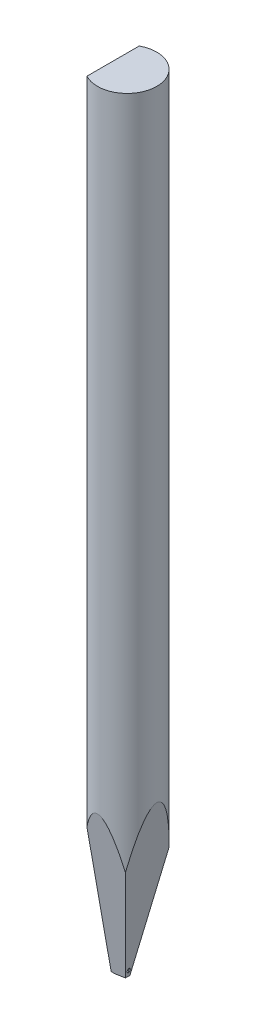
ISO-10303-21;
HEADER;
FILE_DESCRIPTION(('STEP AP214'),'2;1');
FILE_NAME('part.step','',(''),(''),'','','');
FILE_SCHEMA(('AUTOMOTIVE_DESIGN { 1 0 10303 214 1 1 1 1 }'));
ENDSEC;
DATA;
#1=APPLICATION_CONTEXT('core data for automotive mechanical design processes');
#2=APPLICATION_PROTOCOL_DEFINITION('international standard','automotive_design',2000,#1);
#3=PRODUCT_CONTEXT('',#1,'mechanical');
#4=PRODUCT('Part','Part','',(#3));
#5=PRODUCT_RELATED_PRODUCT_CATEGORY('part','',(#4));
#6=PRODUCT_DEFINITION_FORMATION('','',#4);
#7=PRODUCT_DEFINITION_CONTEXT('part definition',#1,'design');
#8=PRODUCT_DEFINITION('design','',#6,#7);
#9=PRODUCT_DEFINITION_SHAPE('','',#8);
#10=(LENGTH_UNIT() NAMED_UNIT(*) SI_UNIT(.MILLI.,.METRE.));
#11=(NAMED_UNIT(*) PLANE_ANGLE_UNIT() SI_UNIT($,.RADIAN.));
#12=(NAMED_UNIT(*) SI_UNIT($,.STERADIAN.) SOLID_ANGLE_UNIT());
#13=UNCERTAINTY_MEASURE_WITH_UNIT(LENGTH_MEASURE(1.E-05),#10,'distance_accuracy_value','');
#14=(GEOMETRIC_REPRESENTATION_CONTEXT(3) GLOBAL_UNCERTAINTY_ASSIGNED_CONTEXT((#13)) GLOBAL_UNIT_ASSIGNED_CONTEXT((#10,
#11,#12)) REPRESENTATION_CONTEXT('',''));
#15=CARTESIAN_POINT('',(0.,0.,0.));
#16=DIRECTION('',(0.,0.,1.));
#17=DIRECTION('',(1.,0.,0.));
#18=AXIS2_PLACEMENT_3D('',#15,#16,#17);
#19=CARTESIAN_POINT('',(0.,0.,0.));
#20=DIRECTION('',(0.,1.,0.));
#21=DIRECTION('',(0.,0.,1.));
#22=AXIS2_PLACEMENT_3D('',#19,#20,#21);
#23=PLANE('',#22);
#24=DIRECTION('',(1.,0.,0.));
#25=VECTOR('',#24,1.);
#26=CARTESIAN_POINT('',(-0.37592,0.,0.0127));
#27=LINE('',#26,#25);
#28=CARTESIAN_POINT('',(-0.35052,0.,0.0127000000000007));
#29=VERTEX_POINT('',#28);
#30=CARTESIAN_POINT('',(-0.296300638325167,0.,0.0127));
#31=VERTEX_POINT('',#30);
#32=EDGE_CURVE('E374',#29,#31,#27,.T.);
#33=ORIENTED_EDGE('',*,*,#32,.T.);
#34=CARTESIAN_POINT('',(-0.270900638325167,0.,0.));
#35=DIRECTION('',(0.,1.,0.));
#36=DIRECTION('',(-1.,0.,0.));
#37=AXIS2_PLACEMENT_3D('',#34,#35,#36);
#38=ELLIPSE('',#37,0.0293293936748331,0.0254);
#39=CARTESIAN_POINT('',(-0.277370032,0.,0.024774386150013));
#40=VERTEX_POINT('',#39);
#41=EDGE_CURVE('E200',#40,#31,#38,.F.);
#42=ORIENTED_EDGE('',*,*,#41,.F.);
#43=DIRECTION('',(0.,0.,-1.));
#44=VECTOR('',#43,1.);
#45=CARTESIAN_POINT('',(-0.277370032,0.,27.2760283406468));
#46=LINE('',#45,#44);
#47=CARTESIAN_POINT('',(-0.277370032000001,0.,0.0508));
#48=VERTEX_POINT('',#47);
#49=EDGE_CURVE('E271',#48,#40,#46,.T.);
#50=ORIENTED_EDGE('',*,*,#49,.F.);
#51=DIRECTION('',(-1.,0.,0.));
#52=VECTOR('',#51,1.);
#53=CARTESIAN_POINT('',(26.8738719491216,0.,0.0508));
#54=LINE('',#53,#52);
#55=CARTESIAN_POINT('',(-0.35052,0.,0.0507999999999983));
#56=VERTEX_POINT('',#55);
#57=EDGE_CURVE('E289',#48,#56,#54,.T.);
#58=ORIENTED_EDGE('',*,*,#57,.T.);
#59=DIRECTION('',(0.,0.,-1.));
#60=VECTOR('',#59,1.);
#61=CARTESIAN_POINT('',(-0.35052,0.,26.4674719491216));
#62=LINE('',#61,#60);
#63=EDGE_CURVE('E365',#56,#29,#62,.T.);
#64=ORIENTED_EDGE('',*,*,#63,.T.);
#65=EDGE_LOOP('',(#33,#42,#50,#58,#64));
#66=FACE_BOUND('',#65,.T.);
#67=ADVANCED_FACE('F43',(#66),#23,.F.);
#68=CARTESIAN_POINT('',(26.8738719491216,0.,0.0508));
#69=DIRECTION('',(0.,-0.173648177666931,0.984807753012208));
#70=DIRECTION('',(0.,-0.984807753012208,-0.173648177666931));
#71=AXIS2_PLACEMENT_3D('',#68,#69,#70);
#72=PLANE('',#71);
#73=CARTESIAN_POINT('',(-0.35052,0.0254,0.0552787053099933));
#74=DIRECTION('',(0.,-0.173648177666931,0.984807753012208));
#75=DIRECTION('',(0.,-0.984807753012208,-0.173648177666931));
#76=AXIS2_PLACEMENT_3D('',#73,#74,#75);
#77=ELLIPSE('',#76,0.0257918359418979,0.0254);
#78=CARTESIAN_POINT('',(-0.37592,0.0254,0.0552787053099933));
#79=VERTEX_POINT('',#78);
#80=EDGE_CURVE('E277',#56,#79,#77,.F.);
#81=ORIENTED_EDGE('',*,*,#80,.F.);
#82=ORIENTED_EDGE('',*,*,#57,.F.);
#83=DIRECTION('',(-0.984346441568213,-0.173566836012845,-0.0306045161452665));
#84=VECTOR('',#83,1.);
#85=CARTESIAN_POINT('',(26.0304978179113,4.63878690685217,0.868743289435208));
#86=LINE('',#85,#84);
#87=CARTESIAN_POINT('',(0.0141435069447581,0.051401702157769,0.0598635069447552));
#88=VERTEX_POINT('',#87);
#89=EDGE_CURVE('E286',#88,#48,#86,.T.);
#90=ORIENTED_EDGE('',*,*,#89,.F.);
#91=DIRECTION('',(-0.171087869746036,-0.970287525247814,-0.171087869746036));
#92=VECTOR('',#91,1.);
#93=CARTESIAN_POINT('',(0.791557999082992,4.46033837772866,0.837277999082991));
#94=LINE('',#93,#92);
#95=CARTESIAN_POINT('',(0.537041505266774,3.0169036135559,0.582761505266773));
#96=VERTEX_POINT('',#95);
#97=EDGE_CURVE('E283',#96,#88,#94,.T.);
#98=ORIENTED_EDGE('',*,*,#97,.F.);
#99=CARTESIAN_POINT('',(0.,-0.288101116436578,0.));
#100=DIRECTION('',(0.,-0.173648177666931,0.984807753012208));
#101=DIRECTION('',(0.,-0.984807753012208,-0.173648177666931));
#102=AXIS2_PLACEMENT_3D('',#99,#100,#101);
#103=ELLIPSE('',#102,4.56371043248163,0.792479999999998);
#104=CARTESIAN_POINT('',(-0.37592,3.66844093071414,0.69764511322018));
#105=VERTEX_POINT('',#104);
#106=EDGE_CURVE('E293',#96,#105,#103,.T.);
#107=ORIENTED_EDGE('',*,*,#106,.T.);
#108=DIRECTION('',(0.,0.984807753012208,0.173648177666931));
#109=VECTOR('',#108,1.);
#110=CARTESIAN_POINT('',(-0.37592,20.2093857917021,3.6142599786234));
#111=LINE('',#110,#109);
#112=EDGE_CURVE('E308',#79,#105,#111,.T.);
#113=ORIENTED_EDGE('',*,*,#112,.F.);
#114=EDGE_LOOP('',(#81,#82,#90,#98,#107,#113));
#115=FACE_BOUND('',#114,.T.);
#116=ADVANCED_FACE('F238',(#115),#72,.T.);
#117=CARTESIAN_POINT('',(26.8738719491216,0.,-0.0508));
#118=DIRECTION('',(0.,-0.173648177666931,-0.984807753012208));
#119=DIRECTION('',(0.,0.984807753012208,-0.173648177666931));
#120=AXIS2_PLACEMENT_3D('',#117,#118,#119);
#121=PLANE('',#120);
#122=CARTESIAN_POINT('',(-0.35052,0.0254,-0.0552787053099933));
#123=DIRECTION('',(0.,-0.173648177666931,-0.984807753012208));
#124=DIRECTION('',(0.,0.984807753012208,-0.173648177666931));
#125=AXIS2_PLACEMENT_3D('',#122,#123,#124);
#126=ELLIPSE('',#125,0.0257918359418979,0.0254);
#127=CARTESIAN_POINT('',(-0.37592,0.0254,-0.0552787053099933));
#128=VERTEX_POINT('',#127);
#129=CARTESIAN_POINT('',(-0.35052,0.,-0.0508000000000002));
#130=VERTEX_POINT('',#129);
#131=EDGE_CURVE('E318',#128,#130,#126,.F.);
#132=ORIENTED_EDGE('',*,*,#131,.F.);
#133=DIRECTION('',(0.,-0.984807753012208,0.173648177666931));
#134=VECTOR('',#133,1.);
#135=CARTESIAN_POINT('',(-0.37592,20.5673030312895,-3.67737044482337));
#136=LINE('',#135,#134);
#137=CARTESIAN_POINT('',(-0.37592,3.66844093071414,-0.69764511322018));
#138=VERTEX_POINT('',#137);
#139=EDGE_CURVE('E310',#138,#128,#136,.T.);
#140=ORIENTED_EDGE('',*,*,#139,.F.);
#141=CARTESIAN_POINT('',(0.,-0.288101116436578,0.));
#142=DIRECTION('',(0.,-0.173648177666931,-0.984807753012208));
#143=DIRECTION('',(0.,-0.984807753012208,0.173648177666931));
#144=AXIS2_PLACEMENT_3D('',#141,#142,#143);
#145=ELLIPSE('',#144,4.56371043248163,0.792479999999998);
#146=CARTESIAN_POINT('',(0.537041505266774,3.0169036135559,-0.582761505266773));
#147=VERTEX_POINT('',#146);
#148=EDGE_CURVE('E296',#138,#147,#145,.T.);
#149=ORIENTED_EDGE('',*,*,#148,.T.);
#150=DIRECTION('',(0.171087869746036,0.970287525247814,-0.171087869746036));
#151=VECTOR('',#150,1.);
#152=CARTESIAN_POINT('',(0.791557999082992,4.46033837772866,-0.837277999082991));
#153=LINE('',#152,#151);
#154=CARTESIAN_POINT('',(0.0141435069447581,0.051401702157769,-0.0598635069447552));
#155=VERTEX_POINT('',#154);
#156=EDGE_CURVE('E313',#155,#147,#153,.T.);
#157=ORIENTED_EDGE('',*,*,#156,.F.);
#158=DIRECTION('',(0.984346441568213,0.173566836012845,-0.0306045161452665));
#159=VECTOR('',#158,1.);
#160=CARTESIAN_POINT('',(26.0304978179113,4.63878690685217,-0.868743289435208));
#161=LINE('',#160,#159);
#162=CARTESIAN_POINT('',(-0.277370032000001,0.,-0.0508));
#163=VERTEX_POINT('',#162);
#164=EDGE_CURVE('E316',#163,#155,#161,.T.);
#165=ORIENTED_EDGE('',*,*,#164,.F.);
#166=DIRECTION('',(-1.,0.,0.));
#167=VECTOR('',#166,1.);
#168=CARTESIAN_POINT('',(26.8738719491216,0.,-0.0508));
#169=LINE('',#168,#167);
#170=EDGE_CURVE('E266',#163,#130,#169,.T.);
#171=ORIENTED_EDGE('',*,*,#170,.T.);
#172=EDGE_LOOP('',(#132,#140,#149,#157,#165,#171));
#173=FACE_BOUND('',#172,.T.);
#174=ADVANCED_FACE('F244',(#173),#121,.T.);
#175=CARTESIAN_POINT('',(-0.277370032,0.,-0.024774386150013));
#176=VERTEX_POINT('',#175);
#177=EDGE_CURVE('E262',#176,#163,#46,.T.);
#178=ORIENTED_EDGE('',*,*,#177,.F.);
#179=CARTESIAN_POINT('',(-0.296300638325167,0.,-0.0127));
#180=VERTEX_POINT('',#179);
#181=EDGE_CURVE('E198',#180,#176,#38,.F.);
#182=ORIENTED_EDGE('',*,*,#181,.F.);
#183=DIRECTION('',(1.,0.,0.));
#184=VECTOR('',#183,1.);
#185=CARTESIAN_POINT('',(-0.37592,0.,-0.0127));
#186=LINE('',#185,#184);
#187=CARTESIAN_POINT('',(-0.35052,0.,-0.0126999999999972));
#188=VERTEX_POINT('',#187);
#189=EDGE_CURVE('E372',#188,#180,#186,.T.);
#190=ORIENTED_EDGE('',*,*,#189,.F.);
#191=EDGE_CURVE('E368',#188,#130,#62,.T.);
#192=ORIENTED_EDGE('',*,*,#191,.T.);
#193=ORIENTED_EDGE('',*,*,#170,.F.);
#194=EDGE_LOOP('',(#178,#182,#190,#192,#193));
#195=FACE_BOUND('',#194,.T.);
#196=ADVANCED_FACE('F240',(#195),#23,.F.);
#197=CARTESIAN_POINT('',(0.,21.0312,0.));
#198=DIRECTION('',(0.,-1.,0.));
#199=DIRECTION('',(0.,0.,-1.));
#200=AXIS2_PLACEMENT_3D('',#197,#198,#199);
#201=CYLINDRICAL_SURFACE('',#200,0.792479999999998);
#202=ORIENTED_EDGE('',*,*,#106,.F.);
#203=CARTESIAN_POINT('',(0.,-0.0288101116436568,0.));
#204=DIRECTION('',(-0.984807753012208,0.173648177666931,0.));
#205=DIRECTION('',(-0.173648177666931,-0.984807753012208,0.));
#206=AXIS2_PLACEMENT_3D('',#203,#204,#205);
#207=ELLIPSE('',#206,4.56371043248164,0.792479999999998);
#208=EDGE_CURVE('E275',#96,#147,#207,.T.);
#209=ORIENTED_EDGE('',*,*,#208,.T.);
#210=ORIENTED_EDGE('',*,*,#148,.F.);
#211=DIRECTION('',(0.,-1.,0.));
#212=VECTOR('',#211,1.);
#213=CARTESIAN_POINT('',(-0.37592,21.0312,-0.69764511322018));
#214=LINE('',#213,#212);
#215=CARTESIAN_POINT('',(-0.37592,21.0312,-0.69764511322018));
#216=VERTEX_POINT('',#215);
#217=EDGE_CURVE('E302',#216,#138,#214,.T.);
#218=ORIENTED_EDGE('',*,*,#217,.F.);
#219=CARTESIAN_POINT('',(0.,21.0312,0.));
#220=DIRECTION('',(0.,1.,0.));
#221=DIRECTION('',(0.,0.,1.));
#222=AXIS2_PLACEMENT_3D('',#219,#220,#221);
#223=CIRCLE('',#222,0.792479999999998);
#224=CARTESIAN_POINT('',(-0.37592,21.0312,0.69764511322018));
#225=VERTEX_POINT('',#224);
#226=EDGE_CURVE('E305',#225,#216,#223,.T.);
#227=ORIENTED_EDGE('',*,*,#226,.F.);
#228=DIRECTION('',(0.,-1.,0.));
#229=VECTOR('',#228,1.);
#230=CARTESIAN_POINT('',(-0.37592,21.0312,0.69764511322018));
#231=LINE('',#230,#229);
#232=EDGE_CURVE('E300',#105,#225,#231,.F.);
#233=ORIENTED_EDGE('',*,*,#232,.F.);
#234=EDGE_LOOP('',(#202,#209,#210,#218,#227,#233));
#235=FACE_BOUND('',#234,.T.);
#236=ADVANCED_FACE('F45',(#235),#201,.T.);
#237=CARTESIAN_POINT('',(-0.37592,21.0312,-1.04648));
#238=DIRECTION('',(-1.,0.,0.));
#239=DIRECTION('',(0.,0.,1.));
#240=AXIS2_PLACEMENT_3D('',#237,#238,#239);
#241=PLANE('',#240);
#242=DIRECTION('',(0.,0.,-1.));
#243=VECTOR('',#242,1.);
#244=CARTESIAN_POINT('',(-0.37592,0.0254,26.4674719491216));
#245=LINE('',#244,#243);
#246=EDGE_CURVE('E356',#79,#128,#245,.T.);
#247=ORIENTED_EDGE('',*,*,#246,.F.);
#248=ORIENTED_EDGE('',*,*,#112,.T.);
#249=ORIENTED_EDGE('',*,*,#232,.T.);
#250=DIRECTION('',(0.,0.,-1.));
#251=VECTOR('',#250,1.);
#252=CARTESIAN_POINT('',(-0.37592,21.0312,-1.04648));
#253=LINE('',#252,#251);
#254=EDGE_CURVE('E298',#225,#216,#253,.T.);
#255=ORIENTED_EDGE('',*,*,#254,.T.);
#256=ORIENTED_EDGE('',*,*,#217,.T.);
#257=ORIENTED_EDGE('',*,*,#139,.T.);
#258=EDGE_LOOP('',(#247,#248,#249,#255,#256,#257));
#259=FACE_BOUND('',#258,.T.);
#260=ADVANCED_FACE('F255',(#259),#241,.T.);
#261=CARTESIAN_POINT('',(0.,21.0312,0.));
#262=DIRECTION('',(0.,1.,0.));
#263=DIRECTION('',(0.,0.,1.));
#264=AXIS2_PLACEMENT_3D('',#261,#262,#263);
#265=PLANE('',#264);
#266=ORIENTED_EDGE('',*,*,#226,.T.);
#267=ORIENTED_EDGE('',*,*,#254,.F.);
#268=EDGE_LOOP('',(#266,#267));
#269=FACE_BOUND('',#268,.T.);
#270=ADVANCED_FACE('F340',(#269),#265,.T.);
#271=CARTESIAN_POINT('',(-0.277370032,0.,27.2760283406468));
#272=DIRECTION('',(-0.173648177666931,0.984807753012208,0.));
#273=DIRECTION('',(-0.984807753012208,-0.173648177666931,0.));
#274=AXIS2_PLACEMENT_3D('',#271,#272,#273);
#275=PLANE('',#274);
#276=ORIENTED_EDGE('',*,*,#49,.T.);
#277=CARTESIAN_POINT('',(-0.270167392080556,0.00127001975012591,0.));
#278=DIRECTION('',(-0.173648177666931,0.984807753012208,0.));
#279=DIRECTION('',(-0.984807753012208,-0.173648177666931,0.));
#280=AXIS2_PLACEMENT_3D('',#277,#278,#279);
#281=ELLIPSE('',#280,0.03315734514904,0.0254);
#282=CARTESIAN_POINT('',(-0.270167392080556,0.00127001975012589,0.0253999999999992));
#283=VERTEX_POINT('',#282);
#284=EDGE_CURVE('E381',#40,#283,#281,.T.);
#285=ORIENTED_EDGE('',*,*,#284,.T.);
#286=DIRECTION('',(-0.984807753012208,-0.173648177666931,0.));
#287=VECTOR('',#286,1.);
#288=CARTESIAN_POINT('',(-0.277370032,0.,0.0253999999999983));
#289=LINE('',#288,#287);
#290=CARTESIAN_POINT('',(-0.109730032,0.0295594550459672,0.0253999999999992));
#291=VERTEX_POINT('',#290);
#292=EDGE_CURVE('E11',#291,#283,#289,.T.);
#293=ORIENTED_EDGE('',*,*,#292,.F.);
#294=DIRECTION('',(0.,0.,1.));
#295=VECTOR('',#294,1.);
#296=CARTESIAN_POINT('',(-0.109730032,0.0295594550459672,27.2760283406468));
#297=LINE('',#296,#295);
#298=CARTESIAN_POINT('',(-0.109730032,0.0295594550459672,-0.0253999999999992));
#299=VERTEX_POINT('',#298);
#300=EDGE_CURVE('E51',#299,#291,#297,.T.);
#301=ORIENTED_EDGE('',*,*,#300,.F.);
#302=DIRECTION('',(-0.984807753012208,-0.173648177666931,0.));
#303=VECTOR('',#302,1.);
#304=CARTESIAN_POINT('',(-0.277370032,0.,-0.0253999999999983));
#305=LINE('',#304,#303);
#306=CARTESIAN_POINT('',(-0.270167392080556,0.00127001975012592,-0.0253999999999992));
#307=VERTEX_POINT('',#306);
#308=EDGE_CURVE('E162',#299,#307,#305,.T.);
#309=ORIENTED_EDGE('',*,*,#308,.T.);
#310=EDGE_CURVE('E378',#307,#176,#281,.T.);
#311=ORIENTED_EDGE('',*,*,#310,.T.);
#312=ORIENTED_EDGE('',*,*,#177,.T.);
#313=ORIENTED_EDGE('',*,*,#164,.T.);
#314=DIRECTION('',(0.,0.,-1.));
#315=VECTOR('',#314,1.);
#316=CARTESIAN_POINT('',(0.014143506944755,0.0514017021577685,27.2760283406468));
#317=LINE('',#316,#315);
#318=EDGE_CURVE('E272',#88,#155,#317,.T.);
#319=ORIENTED_EDGE('',*,*,#318,.F.);
#320=ORIENTED_EDGE('',*,*,#89,.T.);
#321=EDGE_LOOP('',(#276,#285,#293,#301,#309,#311,#312,#313,#319,#320));
#322=FACE_BOUND('',#321,.T.);
#323=ADVANCED_FACE('F337',(#322),#275,.F.);
#324=CARTESIAN_POINT('',(0.014143506944755,0.0514017021577685,27.2760283406468));
#325=DIRECTION('',(-0.984807753012208,0.173648177666931,0.));
#326=DIRECTION('',(-0.173648177666931,-0.984807753012208,0.));
#327=AXIS2_PLACEMENT_3D('',#324,#325,#326);
#328=PLANE('',#327);
#329=CARTESIAN_POINT('',(0.041457366408961,0.206306296760712,0.));
#330=DIRECTION('',(-0.984807753012208,0.173648177666931,0.));
#331=DIRECTION('',(0.173648177666931,0.984807753012208,0.));
#332=AXIS2_PLACEMENT_3D('',#329,#330,#331);
#333=ELLIPSE('',#332,0.0566555398592854,0.0406948626453099);
#334=CARTESIAN_POINT('',(0.051295497660262,0.262101111665229,0.));
#335=VERTEX_POINT('',#334);
#336=EDGE_CURVE('E379',#335,#335,#333,.F.);
#337=ORIENTED_EDGE('',*,*,#336,.F.);
#338=EDGE_LOOP('',(#337));
#339=FACE_BOUND('',#338,.T.);
#340=ORIENTED_EDGE('',*,*,#208,.F.);
#341=ORIENTED_EDGE('',*,*,#97,.T.);
#342=ORIENTED_EDGE('',*,*,#318,.T.);
#343=ORIENTED_EDGE('',*,*,#156,.T.);
#344=EDGE_LOOP('',(#340,#341,#342,#343));
#345=FACE_BOUND('',#344,.T.);
#346=ADVANCED_FACE('F233',(#339,#345),#328,.F.);
#347=CARTESIAN_POINT('',(-0.35052,0.0254,26.4674719491216));
#348=DIRECTION('',(0.,0.,-1.));
#349=DIRECTION('',(-1.,0.,0.));
#350=AXIS2_PLACEMENT_3D('',#347,#348,#349);
#351=CYLINDRICAL_SURFACE('',#350,0.0254);
#352=CARTESIAN_POINT('',(-0.372356044189537,0.0124251329813136,-0.00690606533721928));
#353=CARTESIAN_POINT('',(-0.372565085024047,0.0127763007246613,-0.00674293793804144));
#354=CARTESIAN_POINT('',(-0.372758975671103,0.013122553141233,-0.00654827983197154));
#355=CARTESIAN_POINT('',(-0.373115306615752,0.0137917367460964,-0.00609795392933839));
#356=CARTESIAN_POINT('',(-0.373277686451433,0.0141146223692593,-0.00584217090527828));
#357=CARTESIAN_POINT('',(-0.373569514754141,0.0147231297355548,-0.00527135671603562));
#358=CARTESIAN_POINT('',(-0.373698854155844,0.0150086265862195,-0.00495613514847174));
#359=CARTESIAN_POINT('',(-0.373924308720971,0.0155268984152438,-0.00427526033630703));
#360=CARTESIAN_POINT('',(-0.374020471728201,0.0157597491462164,-0.00390968078753951));
#361=CARTESIAN_POINT('',(-0.374176696167278,0.0161499977725403,-0.00316162052534774));
#362=CARTESIAN_POINT('',(-0.374238553113886,0.0163110373458575,-0.00278141020643539));
#363=CARTESIAN_POINT('',(-0.374336223746036,0.0165701181322777,-0.00199673065065847));
#364=CARTESIAN_POINT('',(-0.374372028000751,0.0166681365308209,-0.00159225268643081));
#365=CARTESIAN_POINT('',(-0.374418197463373,0.0167953127624508,-0.000782247025810471));
#366=CARTESIAN_POINT('',(-0.374429210621058,0.0168262237506599,-0.000377030198045801));
#367=CARTESIAN_POINT('',(-0.37442813978963,0.0168232369009368,0.000433061559799198));
#368=CARTESIAN_POINT('',(-0.374416060741457,0.0167893529269039,0.000837936544478509));
#369=CARTESIAN_POINT('',(-0.374368451120071,0.0166583674502854,0.00163419738926659));
#370=CARTESIAN_POINT('',(-0.374333016175505,0.016561523752701,0.00202563143511048));
#371=CARTESIAN_POINT('',(-0.374237615131593,0.0163086383227702,0.00278567746037549));
#372=CARTESIAN_POINT('',(-0.374177650845214,0.0161526009654951,0.0031542911241357));
#373=CARTESIAN_POINT('',(-0.374031444345224,0.0157869517286266,0.00385976606026629));
#374=CARTESIAN_POINT('',(-0.373945117542882,0.0155771677477868,0.00419652048282355));
#375=CARTESIAN_POINT('',(-0.37374491702162,0.0151127781694206,0.0048284344468843));
#376=CARTESIAN_POINT('',(-0.373631034585299,0.0148581583947547,0.00512358077854302));
#377=CARTESIAN_POINT('',(-0.373372400028037,0.0143084709999814,0.0056719374221388));
#378=CARTESIAN_POINT('',(-0.373227021011214,0.0140126335055587,0.00592407616313995));
#379=CARTESIAN_POINT('',(-0.372907715772747,0.0133970967979482,0.00637448476520452));
#380=CARTESIAN_POINT('',(-0.372733825503236,0.0130774279090214,0.0065728216438519));
#381=CARTESIAN_POINT('',(-0.372484637343933,0.0126434050761706,0.00680113260294513));
#382=CARTESIAN_POINT('',(-0.372421045235312,0.0125344973832766,0.0068550909599953));
#383=CARTESIAN_POINT('',(-0.372356044189537,0.0124251329813136,0.00690606533721928));
#384=B_SPLINE_CURVE_WITH_KNOTS('',3,(#352,#353,#354,#355,#356,#357,#358,#359,#360,#361,#362,
#363,#364,#365,#366,#367,#368,#369,#370,#371,#372,#373,#374,#375,#376,#377,#378,#379,#380,#381,
#382,#383),.UNSPECIFIED.,.F.,.F.,(4,2,2,2,2,2,2,2,2,2,2,2,2,2,2,4),(0.,0.00131964017643907,
0.00264178792759502,0.00396824523292104,0.00529278157389339,0.00653915607785325,
0.0077859815334025,0.00899982126775395,0.0102134013110975,0.0114220430703908,0.0126305955149827,
0.0138430672979802,0.0150559231569195,0.0162955970815821,0.0175337196569338,0.0179450404913313),.UNSPECIFIED.);
#385=CARTESIAN_POINT('',(-0.372356044189536,0.0124251329813136,-0.00690606533721928));
#386=VERTEX_POINT('',#385);
#387=CARTESIAN_POINT('',(-0.372356044189537,0.0124251329813136,0.00690606533721928));
#388=VERTEX_POINT('',#387);
#389=EDGE_CURVE('E324',#386,#388,#384,.T.);
#390=ORIENTED_EDGE('',*,*,#389,.T.);
#391=CARTESIAN_POINT('',(-0.35052,0.0254,0.000855785482863775));
#392=DIRECTION('',(0.,0.422618261740697,0.906307787036651));
#393=DIRECTION('',(0.,0.906307787036651,-0.422618261740697));
#394=AXIS2_PLACEMENT_3D('',#391,#392,#393);
#395=ELLIPSE('',#394,0.0280257991416472,0.0254);
#396=EDGE_CURVE('E331',#388,#29,#395,.T.);
#397=ORIENTED_EDGE('',*,*,#396,.T.);
#398=ORIENTED_EDGE('',*,*,#63,.F.);
#399=ORIENTED_EDGE('',*,*,#80,.T.);
#400=ORIENTED_EDGE('',*,*,#246,.T.);
#401=ORIENTED_EDGE('',*,*,#131,.T.);
#402=ORIENTED_EDGE('',*,*,#191,.F.);
#403=CARTESIAN_POINT('',(-0.35052,0.0254,-0.000855785482860305));
#404=DIRECTION('',(0.,0.422618261740697,-0.906307787036651));
#405=DIRECTION('',(0.,-0.906307787036651,-0.422618261740697));
#406=AXIS2_PLACEMENT_3D('',#403,#404,#405);
#407=ELLIPSE('',#406,0.0280257991416472,0.0254);
#408=EDGE_CURVE('E321',#188,#386,#407,.T.);
#409=ORIENTED_EDGE('',*,*,#408,.T.);
#410=EDGE_LOOP('',(#390,#397,#398,#399,#400,#401,#402,#409));
#411=FACE_BOUND('',#410,.T.);
#412=ADVANCED_FACE('F225',(#411),#351,.T.);
#413=CARTESIAN_POINT('',(-0.37592,0.,0.0127));
#414=DIRECTION('',(0.,0.422618261740697,0.906307787036651));
#415=DIRECTION('',(0.,-0.906307787036651,0.422618261740697));
#416=AXIS2_PLACEMENT_3D('',#413,#414,#415);
#417=PLANE('',#416);
#418=DIRECTION('',(1.,0.,0.));
#419=VECTOR('',#418,1.);
#420=CARTESIAN_POINT('',(-0.37592,0.0124251329813136,0.00690606533721928));
#421=LINE('',#420,#419);
#422=CARTESIAN_POINT('',(-0.291951471731182,0.0124251329813136,0.00690606533721928));
#423=VERTEX_POINT('',#422);
#424=EDGE_CURVE('E375',#388,#423,#421,.T.);
#425=ORIENTED_EDGE('',*,*,#424,.T.);
#426=CARTESIAN_POINT('',(-0.25517636639766,0.0272352378904716,0.));
#427=DIRECTION('',(0.,0.422618261740697,0.906307787036651));
#428=DIRECTION('',(-0.537278777543525,-0.764384261857971,0.356438235077525));
#429=AXIS2_PLACEMENT_3D('',#426,#427,#428);
#430=ELLIPSE('',#429,0.0693992577462932,0.0254);
#431=EDGE_CURVE('E208',#423,#31,#430,.T.);
#432=ORIENTED_EDGE('',*,*,#431,.T.);
#433=ORIENTED_EDGE('',*,*,#32,.F.);
#434=ORIENTED_EDGE('',*,*,#396,.F.);
#435=EDGE_LOOP('',(#425,#432,#433,#434));
#436=FACE_BOUND('',#435,.T.);
#437=ADVANCED_FACE('F223',(#436),#417,.F.);
#438=CARTESIAN_POINT('',(-0.37592,0.00920478182684946,0.));
#439=DIRECTION('',(1.,0.,0.));
#440=DIRECTION('',(0.,0.,-1.));
#441=AXIS2_PLACEMENT_3D('',#438,#439,#440);
#442=CYLINDRICAL_SURFACE('',#441,0.00762);
#443=DIRECTION('',(1.,0.,0.));
#444=VECTOR('',#443,1.);
#445=CARTESIAN_POINT('',(-0.37592,0.0124251329813136,-0.00690606533721928));
#446=LINE('',#445,#444);
#447=CARTESIAN_POINT('',(-0.291951471731183,0.0124251329813136,-0.00690606533721928));
#448=VERTEX_POINT('',#447);
#449=EDGE_CURVE('E65',#386,#448,#446,.T.);
#450=ORIENTED_EDGE('',*,*,#449,.T.);
#451=CARTESIAN_POINT('',(-0.291951471731183,0.0124251329813134,-0.00690606533721935));
#452=CARTESIAN_POINT('',(-0.291797020078325,0.0127875773984236,-0.0067376605717912));
#453=CARTESIAN_POINT('',(-0.291656108113368,0.0131412732206937,-0.00653743767782388));
#454=CARTESIAN_POINT('',(-0.291401081398828,0.0138187065829609,-0.00607794913229227));
#455=CARTESIAN_POINT('',(-0.291286969006444,0.0141424414861815,-0.00581867829101938));
#456=CARTESIAN_POINT('',(-0.291085091304687,0.014748008836136,-0.00524516450676976));
#457=CARTESIAN_POINT('',(-0.290997377379951,0.0150297590285152,-0.00493081621236109));
#458=CARTESIAN_POINT('',(-0.2908463733095,0.015539354077924,-0.00425629200600235));
#459=CARTESIAN_POINT('',(-0.290783066521863,0.0157672356239441,-0.003896147543617));
#460=CARTESIAN_POINT('',(-0.290679363853753,0.0161554707123359,-0.00315031924037568));
#461=CARTESIAN_POINT('',(-0.290638412164088,0.0163174342235253,-0.00276554948291216));
#462=CARTESIAN_POINT('',(-0.290574467318301,0.0165766475476053,-0.00197326206817626));
#463=CARTESIAN_POINT('',(-0.290551479130311,0.0166738794566973,-0.00156573815119431));
#464=CARTESIAN_POINT('',(-0.290521871124044,0.0168000903490509,-0.000741049573188628));
#465=CARTESIAN_POINT('',(-0.290515198193887,0.0168292907839289,-0.000323920668430717));
#466=CARTESIAN_POINT('',(-0.290517542021225,0.0168191434189421,0.000509458765890079));
#467=CARTESIAN_POINT('',(-0.290526558726771,0.0167797958460412,0.000925709298356705));
#468=CARTESIAN_POINT('',(-0.290561015003861,0.0166337013380769,0.0017462898989422));
#469=CARTESIAN_POINT('',(-0.290586484063791,0.0165268333903916,0.00215059719723273));
#470=CARTESIAN_POINT('',(-0.290655657835194,0.0162492111016922,0.00293485542293941));
#471=CARTESIAN_POINT('',(-0.290699356697201,0.0160784772553825,0.00331481411810805));
#472=CARTESIAN_POINT('',(-0.29080739244786,0.0156794450669001,0.00403902310717424));
#473=CARTESIAN_POINT('',(-0.290871690572617,0.0154512550176684,0.0043833388767326));
#474=CARTESIAN_POINT('',(-0.291023526648529,0.0149452695797708,0.00502784423286179));
#475=CARTESIAN_POINT('',(-0.291111076910428,0.0146674479394547,0.00532801031337788));
#476=CARTESIAN_POINT('',(-0.29131000019357,0.0140766324295696,0.00587267737740257));
#477=CARTESIAN_POINT('',(-0.291421034213405,0.0137641663620439,0.00611787774501159));
#478=CARTESIAN_POINT('',(-0.291667737874415,0.0131121867453646,0.00655378657106843));
#479=CARTESIAN_POINT('',(-0.291803402488327,0.0127726787235707,0.00674450612899611));
#480=CARTESIAN_POINT('',(-0.291951471724233,0.012425132991893,0.00690606535123092));
#481=B_SPLINE_CURVE_WITH_KNOTS('',3,(#451,#452,#453,#454,#455,#456,#457,#458,#459,#460,#461,
#462,#463,#464,#465,#466,#467,#468,#469,#470,#471,#472,#473,#474,#475,#476,#477,#478,#479,#480),
.UNSPECIFIED.,.F.,.F.,(4,2,2,2,2,2,2,2,2,2,2,2,2,2,4),(0.,0.00128434761159655,
0.00256880814775918,0.00385575295322726,0.00514181870133406,0.00639425517029201,
0.00764703790079621,0.00889573692235716,0.0101444318094561,0.0113953710288294,
0.0126459091630109,0.0138941077102706,0.0151429684328572,0.0163749009630912,0.017606582330054),.UNSPECIFIED.);
#482=EDGE_CURVE('E58',#448,#423,#481,.T.);
#483=ORIENTED_EDGE('',*,*,#482,.T.);
#484=ORIENTED_EDGE('',*,*,#424,.F.);
#485=ORIENTED_EDGE('',*,*,#389,.F.);
#486=EDGE_LOOP('',(#450,#483,#484,#485));
#487=FACE_BOUND('',#486,.T.);
#488=ADVANCED_FACE('F210',(#487),#442,.F.);
#489=CARTESIAN_POINT('',(-0.37592,0.0124251329813136,-0.00690606533721928));
#490=DIRECTION('',(0.,0.422618261740697,-0.906307787036651));
#491=DIRECTION('',(0.,0.906307787036651,0.422618261740697));
#492=AXIS2_PLACEMENT_3D('',#489,#490,#491);
#493=PLANE('',#492);
#494=ORIENTED_EDGE('',*,*,#189,.T.);
#495=CARTESIAN_POINT('',(-0.25517636639766,0.0272352378904716,0.));
#496=DIRECTION('',(0.,0.422618261740697,-0.906307787036651));
#497=DIRECTION('',(-0.537278777543525,-0.764384261857971,-0.356438235077525));
#498=AXIS2_PLACEMENT_3D('',#495,#496,#497);
#499=ELLIPSE('',#498,0.0693992577462932,0.0254);
#500=EDGE_CURVE('E386',#180,#448,#499,.T.);
#501=ORIENTED_EDGE('',*,*,#500,.T.);
#502=ORIENTED_EDGE('',*,*,#449,.F.);
#503=ORIENTED_EDGE('',*,*,#408,.F.);
#504=EDGE_LOOP('',(#494,#501,#502,#503));
#505=FACE_BOUND('',#504,.T.);
#506=ADVANCED_FACE('F231',(#505),#493,.F.);
#507=CARTESIAN_POINT('',(-0.109730032,0.1016,0.0254));
#508=DIRECTION('',(-1.,0.,0.));
#509=DIRECTION('',(0.,0.,1.));
#510=AXIS2_PLACEMENT_3D('',#507,#508,#509);
#511=PLANE('',#510);
#512=ORIENTED_EDGE('',*,*,#300,.T.);
#513=DIRECTION('',(0.,1.,0.));
#514=VECTOR('',#513,1.);
#515=CARTESIAN_POINT('',(-0.109730032,0.1016,0.0254));
#516=LINE('',#515,#514);
#517=CARTESIAN_POINT('',(-0.109730032,0.1016,0.0254));
#518=VERTEX_POINT('',#517);
#519=EDGE_CURVE('E172',#291,#518,#516,.T.);
#520=ORIENTED_EDGE('',*,*,#519,.T.);
#521=CARTESIAN_POINT('',(-0.109730032,0.1016,0.));
#522=DIRECTION('',(-1.,0.,0.));
#523=DIRECTION('',(0.,1.,0.));
#524=AXIS2_PLACEMENT_3D('',#521,#522,#523);
#525=ELLIPSE('',#524,0.0293293936748329,0.0254);
#526=CARTESIAN_POINT('',(-0.109730032,0.1016,-0.0254));
#527=VERTEX_POINT('',#526);
#528=EDGE_CURVE('E168',#518,#527,#525,.F.);
#529=ORIENTED_EDGE('',*,*,#528,.T.);
#530=DIRECTION('',(0.,1.,0.));
#531=VECTOR('',#530,1.);
#532=CARTESIAN_POINT('',(-0.109730032,0.1016,-0.0254));
#533=LINE('',#532,#531);
#534=EDGE_CURVE('E155',#299,#527,#533,.T.);
#535=ORIENTED_EDGE('',*,*,#534,.F.);
#536=EDGE_LOOP('',(#512,#520,#529,#535));
#537=FACE_BOUND('',#536,.T.);
#538=ADVANCED_FACE('F170',(#537),#511,.T.);
#539=CARTESIAN_POINT('',(0.,0.,0.0254));
#540=DIRECTION('',(0.,0.,-1.));
#541=DIRECTION('',(-1.,0.,0.));
#542=AXIS2_PLACEMENT_3D('',#539,#540,#541);
#543=PLANE('',#542);
#544=ORIENTED_EDGE('',*,*,#292,.T.);
#545=DIRECTION('',(-0.500000000000004,-0.866025403784436,0.));
#546=VECTOR('',#545,1.);
#547=CARTESIAN_POINT('',(-0.203175478743874,0.117303417345508,0.0254));
#548=LINE('',#547,#546);
#549=CARTESIAN_POINT('',(-0.2122418509755,0.1016,0.0254));
#550=VERTEX_POINT('',#549);
#551=EDGE_CURVE('E192',#550,#283,#548,.T.);
#552=ORIENTED_EDGE('',*,*,#551,.F.);
#553=DIRECTION('',(-1.,0.,0.));
#554=VECTOR('',#553,1.);
#555=CARTESIAN_POINT('',(-0.241571244650333,0.1016,0.0254));
#556=LINE('',#555,#554);
#557=EDGE_CURVE('E165',#518,#550,#556,.T.);
#558=ORIENTED_EDGE('',*,*,#557,.F.);
#559=ORIENTED_EDGE('',*,*,#519,.F.);
#560=EDGE_LOOP('',(#544,#552,#558,#559));
#561=FACE_BOUND('',#560,.T.);
#562=ADVANCED_FACE('F389',(#561),#543,.T.);
#563=CARTESIAN_POINT('',(0.,0.,-0.0254));
#564=DIRECTION('',(0.,0.,-1.));
#565=DIRECTION('',(-1.,0.,0.));
#566=AXIS2_PLACEMENT_3D('',#563,#564,#565);
#567=PLANE('',#566);
#568=ORIENTED_EDGE('',*,*,#534,.T.);
#569=DIRECTION('',(-1.,0.,0.));
#570=VECTOR('',#569,1.);
#571=CARTESIAN_POINT('',(-0.241571244650333,0.1016,-0.0254));
#572=LINE('',#571,#570);
#573=CARTESIAN_POINT('',(-0.2122418509755,0.1016,-0.0254));
#574=VERTEX_POINT('',#573);
#575=EDGE_CURVE('E160',#527,#574,#572,.T.);
#576=ORIENTED_EDGE('',*,*,#575,.T.);
#577=DIRECTION('',(0.500000000000004,0.866025403784436,0.));
#578=VECTOR('',#577,1.);
#579=CARTESIAN_POINT('',(-0.2122418509755,0.1016,-0.0254));
#580=LINE('',#579,#578);
#581=EDGE_CURVE('E195',#307,#574,#580,.T.);
#582=ORIENTED_EDGE('',*,*,#581,.F.);
#583=ORIENTED_EDGE('',*,*,#308,.F.);
#584=EDGE_LOOP('',(#568,#576,#582,#583));
#585=FACE_BOUND('',#584,.T.);
#586=ADVANCED_FACE('F157',(#585),#567,.F.);
#587=CARTESIAN_POINT('',(0.0113644253139916,0.171513917527604,0.));
#588=DIRECTION('',(0.866025403784441,0.499999999999995,0.));
#589=DIRECTION('',(-0.499999999999995,0.866025403784441,0.));
#590=AXIS2_PLACEMENT_3D('',#587,#588,#589);
#591=CONICAL_SURFACE('',#590,0.0254,0.392699081698725);
#592=CARTESIAN_POINT('',(0.0113644253139916,0.171513917527604,0.));
#593=DIRECTION('',(0.866025403784441,0.499999999999995,0.));
#594=DIRECTION('',(-0.499999999999995,0.866025403784441,0.));
#595=AXIS2_PLACEMENT_3D('',#592,#593,#594);
#596=CIRCLE('',#595,0.0254);
#597=CARTESIAN_POINT('',(-0.00133557468600829,0.193510962783729,0.));
#598=VERTEX_POINT('',#597);
#599=EDGE_CURVE('E176',#598,#598,#596,.T.);
#600=ORIENTED_EDGE('',*,*,#599,.F.);
#601=EDGE_LOOP('',(#600));
#602=FACE_BOUND('',#601,.T.);
#603=ORIENTED_EDGE('',*,*,#336,.T.);
#604=EDGE_LOOP('',(#603));
#605=FACE_BOUND('',#604,.T.);
#606=ADVANCED_FACE('F221',(#602,#605),#591,.F.);
#607=CARTESIAN_POINT('',(-0.2122418509755,0.1016,0.));
#608=DIRECTION('',(-0.500000000000004,-0.866025403784436,0.));
#609=DIRECTION('',(0.866025403784436,-0.500000000000004,0.));
#610=AXIS2_PLACEMENT_3D('',#607,#608,#609);
#611=CYLINDRICAL_SURFACE('',#610,0.0254);
#612=ORIENTED_EDGE('',*,*,#41,.T.);
#613=ORIENTED_EDGE('',*,*,#431,.F.);
#614=ORIENTED_EDGE('',*,*,#482,.F.);
#615=ORIENTED_EDGE('',*,*,#500,.F.);
#616=ORIENTED_EDGE('',*,*,#181,.T.);
#617=ORIENTED_EDGE('',*,*,#310,.F.);
#618=ORIENTED_EDGE('',*,*,#581,.T.);
#619=CARTESIAN_POINT('',(-0.2122418509755,0.1016,0.));
#620=DIRECTION('',(0.,-1.,0.));
#621=DIRECTION('',(-1.,0.,0.));
#622=AXIS2_PLACEMENT_3D('',#619,#620,#621);
#623=ELLIPSE('',#622,0.0293293936748331,0.0254);
#624=EDGE_CURVE('E185',#574,#550,#623,.F.);
#625=ORIENTED_EDGE('',*,*,#624,.T.);
#626=ORIENTED_EDGE('',*,*,#551,.T.);
#627=ORIENTED_EDGE('',*,*,#284,.F.);
#628=EDGE_LOOP('',(#612,#613,#614,#615,#616,#617,#618,#625,#626,#627));
#629=FACE_BOUND('',#628,.T.);
#630=ADVANCED_FACE('F215',(#629),#611,.F.);
#631=CARTESIAN_POINT('',(-0.241571244650333,0.1016,0.0254));
#632=DIRECTION('',(0.,-1.,0.));
#633=DIRECTION('',(0.,0.,-1.));
#634=AXIS2_PLACEMENT_3D('',#631,#632,#633);
#635=PLANE('',#634);
#636=ORIENTED_EDGE('',*,*,#575,.F.);
#637=CARTESIAN_POINT('',(-0.109730032,0.1016,0.));
#638=DIRECTION('',(0.,-1.,0.));
#639=DIRECTION('',(1.,0.,0.));
#640=AXIS2_PLACEMENT_3D('',#637,#638,#639);
#641=ELLIPSE('',#640,0.0508000000000005,0.0254);
#642=EDGE_CURVE('E177',#527,#518,#641,.F.);
#643=ORIENTED_EDGE('',*,*,#642,.T.);
#644=ORIENTED_EDGE('',*,*,#557,.T.);
#645=ORIENTED_EDGE('',*,*,#624,.F.);
#646=EDGE_LOOP('',(#636,#643,#644,#645));
#647=FACE_BOUND('',#646,.T.);
#648=ADVANCED_FACE('F184',(#647),#635,.T.);
#649=CARTESIAN_POINT('',(-0.298331173319819,-0.00728891971046671,0.));
#650=DIRECTION('',(0.866025403784441,0.499999999999995,0.));
#651=DIRECTION('',(-0.499999999999995,0.866025403784441,0.));
#652=AXIS2_PLACEMENT_3D('',#649,#650,#651);
#653=CYLINDRICAL_SURFACE('',#652,0.0254);
#654=ORIENTED_EDGE('',*,*,#599,.T.);
#655=EDGE_LOOP('',(#654));
#656=FACE_BOUND('',#655,.T.);
#657=ORIENTED_EDGE('',*,*,#528,.F.);
#658=ORIENTED_EDGE('',*,*,#642,.F.);
#659=EDGE_LOOP('',(#657,#658));
#660=FACE_BOUND('',#659,.T.);
#661=ADVANCED_FACE('F179',(#656,#660),#653,.F.);
#662=CLOSED_SHELL('',(#67,#116,#174,#196,#236,#260,#270,#323,#346,#412,#437,#488,#506,#538,#562,
#586,#606,#630,#648,#661));
#663=MANIFOLD_SOLID_BREP('B2',#662);
#664=ADVANCED_BREP_SHAPE_REPRESENTATION('',(#18,#663),#14);
#665=SHAPE_DEFINITION_REPRESENTATION(#9,#664);
ENDSEC;
END-ISO-10303-21;
